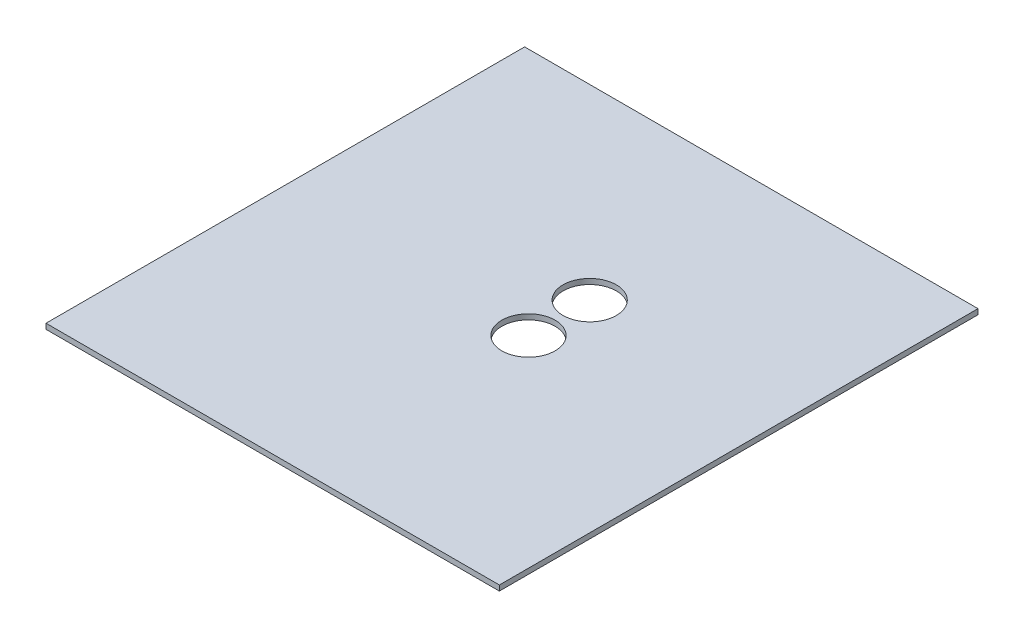
ISO-10303-21;
HEADER;
FILE_DESCRIPTION(('STEP AP214'),'2;1');
FILE_NAME('part.step','',(''),(''),'','','');
FILE_SCHEMA(('AUTOMOTIVE_DESIGN { 1 0 10303 214 1 1 1 1 }'));
ENDSEC;
DATA;
#1=APPLICATION_CONTEXT('core data for automotive mechanical design processes');
#2=APPLICATION_PROTOCOL_DEFINITION('international standard','automotive_design',2000,#1);
#3=PRODUCT_CONTEXT('',#1,'mechanical');
#4=PRODUCT('Part','Part','',(#3));
#5=PRODUCT_RELATED_PRODUCT_CATEGORY('part','',(#4));
#6=PRODUCT_DEFINITION_FORMATION('','',#4);
#7=PRODUCT_DEFINITION_CONTEXT('part definition',#1,'design');
#8=PRODUCT_DEFINITION('design','',#6,#7);
#9=PRODUCT_DEFINITION_SHAPE('','',#8);
#10=(LENGTH_UNIT() NAMED_UNIT(*) SI_UNIT(.MILLI.,.METRE.));
#11=(NAMED_UNIT(*) PLANE_ANGLE_UNIT() SI_UNIT($,.RADIAN.));
#12=(NAMED_UNIT(*) SI_UNIT($,.STERADIAN.) SOLID_ANGLE_UNIT());
#13=UNCERTAINTY_MEASURE_WITH_UNIT(LENGTH_MEASURE(1.E-05),#10,'distance_accuracy_value','');
#14=(GEOMETRIC_REPRESENTATION_CONTEXT(3) GLOBAL_UNCERTAINTY_ASSIGNED_CONTEXT((#13)) GLOBAL_UNIT_ASSIGNED_CONTEXT((#10,
#11,#12)) REPRESENTATION_CONTEXT('',''));
#15=CARTESIAN_POINT('',(0.,0.,0.));
#16=DIRECTION('',(0.,0.,1.));
#17=DIRECTION('',(1.,0.,0.));
#18=AXIS2_PLACEMENT_3D('',#15,#16,#17);
#19=CARTESIAN_POINT('',(-44.6262834338455,-2.,-26.2719249247639));
#20=DIRECTION('',(-1.,0.,0.));
#21=DIRECTION('',(0.,0.,1.));
#22=AXIS2_PLACEMENT_3D('',#19,#20,#21);
#23=PLANE('',#22);
#24=DIRECTION('',(0.,0.,1.));
#25=VECTOR('',#24,1.);
#26=CARTESIAN_POINT('',(-44.6262834338455,0.,-26.2719249247639));
#27=LINE('',#26,#25);
#28=CARTESIAN_POINT('',(-44.6262834338455,0.,-26.2719249247639));
#29=VERTEX_POINT('',#28);
#30=CARTESIAN_POINT('',(-44.6262834338455,0.,153.529323459775));
#31=VERTEX_POINT('',#30);
#32=EDGE_CURVE('E104',#29,#31,#27,.T.);
#33=ORIENTED_EDGE('',*,*,#32,.F.);
#34=DIRECTION('',(0.,1.,0.));
#35=VECTOR('',#34,1.);
#36=CARTESIAN_POINT('',(-44.6262834338455,-2.,-26.2719249247639));
#37=LINE('',#36,#35);
#38=CARTESIAN_POINT('',(-44.6262834338455,-2.,-26.2719249247639));
#39=VERTEX_POINT('',#38);
#40=EDGE_CURVE('E11',#39,#29,#37,.T.);
#41=ORIENTED_EDGE('',*,*,#40,.F.);
#42=DIRECTION('',(0.,0.,1.));
#43=VECTOR('',#42,1.);
#44=CARTESIAN_POINT('',(-44.6262834338455,-2.,-26.2719249247639));
#45=LINE('',#44,#43);
#46=CARTESIAN_POINT('',(-44.6262834338455,-2.,153.529323459775));
#47=VERTEX_POINT('',#46);
#48=EDGE_CURVE('E97',#39,#47,#45,.T.);
#49=ORIENTED_EDGE('',*,*,#48,.T.);
#50=DIRECTION('',(0.,1.,0.));
#51=VECTOR('',#50,1.);
#52=CARTESIAN_POINT('',(-44.6262834338455,-2.,153.529323459775));
#53=LINE('',#52,#51);
#54=EDGE_CURVE('E42',#47,#31,#53,.T.);
#55=ORIENTED_EDGE('',*,*,#54,.T.);
#56=EDGE_LOOP('',(#33,#41,#49,#55));
#57=FACE_BOUND('',#56,.T.);
#58=ADVANCED_FACE('F39',(#57),#23,.T.);
#59=CARTESIAN_POINT('',(-44.6262834338455,-2.,-26.2719249247639));
#60=DIRECTION('',(0.,0.,-1.));
#61=DIRECTION('',(-1.,0.,0.));
#62=AXIS2_PLACEMENT_3D('',#59,#60,#61);
#63=PLANE('',#62);
#64=DIRECTION('',(-1.,0.,0.));
#65=VECTOR('',#64,1.);
#66=CARTESIAN_POINT('',(-44.6262834338455,0.,-26.2719249247639));
#67=LINE('',#66,#65);
#68=CARTESIAN_POINT('',(125.68506485502,0.,-26.2719249247639));
#69=VERTEX_POINT('',#68);
#70=EDGE_CURVE('E99',#69,#29,#67,.T.);
#71=ORIENTED_EDGE('',*,*,#70,.F.);
#72=DIRECTION('',(0.,1.,0.));
#73=VECTOR('',#72,1.);
#74=CARTESIAN_POINT('',(125.68506485502,-2.,-26.2719249247639));
#75=LINE('',#74,#73);
#76=CARTESIAN_POINT('',(125.68506485502,-2.,-26.2719249247639));
#77=VERTEX_POINT('',#76);
#78=EDGE_CURVE('E48',#77,#69,#75,.T.);
#79=ORIENTED_EDGE('',*,*,#78,.F.);
#80=DIRECTION('',(-1.,0.,0.));
#81=VECTOR('',#80,1.);
#82=CARTESIAN_POINT('',(-44.6262834338455,-2.,-26.2719249247639));
#83=LINE('',#82,#81);
#84=EDGE_CURVE('E94',#77,#39,#83,.T.);
#85=ORIENTED_EDGE('',*,*,#84,.T.);
#86=ORIENTED_EDGE('',*,*,#40,.T.);
#87=EDGE_LOOP('',(#71,#79,#85,#86));
#88=FACE_BOUND('',#87,.T.);
#89=ADVANCED_FACE('F115',(#88),#63,.T.);
#90=CARTESIAN_POINT('',(125.68506485502,-2.,-26.2719249247639));
#91=DIRECTION('',(1.,0.,0.));
#92=DIRECTION('',(0.,0.,-1.));
#93=AXIS2_PLACEMENT_3D('',#90,#91,#92);
#94=PLANE('',#93);
#95=DIRECTION('',(0.,0.,-1.));
#96=VECTOR('',#95,1.);
#97=CARTESIAN_POINT('',(125.68506485502,0.,-26.2719249247639));
#98=LINE('',#97,#96);
#99=CARTESIAN_POINT('',(125.68506485502,0.,153.529323459775));
#100=VERTEX_POINT('',#99);
#101=EDGE_CURVE('E89',#100,#69,#98,.T.);
#102=ORIENTED_EDGE('',*,*,#101,.F.);
#103=DIRECTION('',(0.,1.,0.));
#104=VECTOR('',#103,1.);
#105=CARTESIAN_POINT('',(125.68506485502,-2.,153.529323459775));
#106=LINE('',#105,#104);
#107=CARTESIAN_POINT('',(125.68506485502,-2.,153.529323459775));
#108=VERTEX_POINT('',#107);
#109=EDGE_CURVE('E84',#108,#100,#106,.T.);
#110=ORIENTED_EDGE('',*,*,#109,.F.);
#111=DIRECTION('',(0.,0.,-1.));
#112=VECTOR('',#111,1.);
#113=CARTESIAN_POINT('',(125.68506485502,-2.,-26.2719249247639));
#114=LINE('',#113,#112);
#115=EDGE_CURVE('E87',#108,#77,#114,.T.);
#116=ORIENTED_EDGE('',*,*,#115,.T.);
#117=ORIENTED_EDGE('',*,*,#78,.T.);
#118=EDGE_LOOP('',(#102,#110,#116,#117));
#119=FACE_BOUND('',#118,.T.);
#120=ADVANCED_FACE('F86',(#119),#94,.T.);
#121=CARTESIAN_POINT('',(-44.6262834338455,-2.,153.529323459775));
#122=DIRECTION('',(0.,0.,1.));
#123=DIRECTION('',(1.,0.,0.));
#124=AXIS2_PLACEMENT_3D('',#121,#122,#123);
#125=PLANE('',#124);
#126=DIRECTION('',(1.,0.,0.));
#127=VECTOR('',#126,1.);
#128=CARTESIAN_POINT('',(-44.6262834338455,0.,153.529323459775));
#129=LINE('',#128,#127);
#130=EDGE_CURVE('E107',#31,#100,#129,.T.);
#131=ORIENTED_EDGE('',*,*,#130,.F.);
#132=ORIENTED_EDGE('',*,*,#54,.F.);
#133=DIRECTION('',(1.,0.,0.));
#134=VECTOR('',#133,1.);
#135=CARTESIAN_POINT('',(-44.6262834338455,-2.,153.529323459775));
#136=LINE('',#135,#134);
#137=EDGE_CURVE('E93',#47,#108,#136,.T.);
#138=ORIENTED_EDGE('',*,*,#137,.T.);
#139=ORIENTED_EDGE('',*,*,#109,.T.);
#140=EDGE_LOOP('',(#131,#132,#138,#139));
#141=FACE_BOUND('',#140,.T.);
#142=ADVANCED_FACE('F96',(#141),#125,.T.);
#143=CARTESIAN_POINT('',(0.,-2.,0.));
#144=DIRECTION('',(0.,1.,0.));
#145=DIRECTION('',(0.,0.,1.));
#146=AXIS2_PLACEMENT_3D('',#143,#144,#145);
#147=PLANE('',#146);
#148=CARTESIAN_POINT('',(49.9865499232897,-2.,43.8958022297375));
#149=DIRECTION('',(0.,1.,0.));
#150=DIRECTION('',(0.,0.,1.));
#151=AXIS2_PLACEMENT_3D('',#148,#149,#150);
#152=CIRCLE('',#151,10.);
#153=CARTESIAN_POINT('',(49.9865499232897,-2.,53.8958022297375));
#154=VERTEX_POINT('',#153);
#155=EDGE_CURVE('E108',#154,#154,#152,.T.);
#156=ORIENTED_EDGE('',*,*,#155,.T.);
#157=EDGE_LOOP('',(#156));
#158=FACE_BOUND('',#157,.T.);
#159=CARTESIAN_POINT('',(49.9865499232897,-2.,66.8958022297375));
#160=DIRECTION('',(0.,1.,0.));
#161=DIRECTION('',(0.,0.,1.));
#162=AXIS2_PLACEMENT_3D('',#159,#160,#161);
#163=CIRCLE('',#162,10.);
#164=CARTESIAN_POINT('',(49.9865499232897,-2.,76.8958022297375));
#165=VERTEX_POINT('',#164);
#166=EDGE_CURVE('E151',#165,#165,#163,.T.);
#167=ORIENTED_EDGE('',*,*,#166,.T.);
#168=EDGE_LOOP('',(#167));
#169=FACE_BOUND('',#168,.T.);
#170=ORIENTED_EDGE('',*,*,#48,.F.);
#171=ORIENTED_EDGE('',*,*,#84,.F.);
#172=ORIENTED_EDGE('',*,*,#115,.F.);
#173=ORIENTED_EDGE('',*,*,#137,.F.);
#174=EDGE_LOOP('',(#170,#171,#172,#173));
#175=FACE_BOUND('',#174,.T.);
#176=ADVANCED_FACE('F92',(#158,#169,#175),#147,.F.);
#177=CARTESIAN_POINT('',(0.,0.,0.));
#178=DIRECTION('',(0.,1.,0.));
#179=DIRECTION('',(0.,0.,1.));
#180=AXIS2_PLACEMENT_3D('',#177,#178,#179);
#181=PLANE('',#180);
#182=CARTESIAN_POINT('',(49.9865499232897,0.,43.8958022297375));
#183=DIRECTION('',(0.,1.,0.));
#184=DIRECTION('',(0.,0.,1.));
#185=AXIS2_PLACEMENT_3D('',#182,#183,#184);
#186=CIRCLE('',#185,10.);
#187=CARTESIAN_POINT('',(49.9865499232897,0.,53.8958022297375));
#188=VERTEX_POINT('',#187);
#189=EDGE_CURVE('E150',#188,#188,#186,.T.);
#190=ORIENTED_EDGE('',*,*,#189,.F.);
#191=EDGE_LOOP('',(#190));
#192=FACE_BOUND('',#191,.T.);
#193=CARTESIAN_POINT('',(49.9865499232897,0.,66.8958022297375));
#194=DIRECTION('',(0.,1.,0.));
#195=DIRECTION('',(0.,0.,1.));
#196=AXIS2_PLACEMENT_3D('',#193,#194,#195);
#197=CIRCLE('',#196,10.);
#198=CARTESIAN_POINT('',(49.9865499232897,0.,76.8958022297375));
#199=VERTEX_POINT('',#198);
#200=EDGE_CURVE('E155',#199,#199,#197,.T.);
#201=ORIENTED_EDGE('',*,*,#200,.F.);
#202=EDGE_LOOP('',(#201));
#203=FACE_BOUND('',#202,.T.);
#204=ORIENTED_EDGE('',*,*,#32,.T.);
#205=ORIENTED_EDGE('',*,*,#130,.T.);
#206=ORIENTED_EDGE('',*,*,#101,.T.);
#207=ORIENTED_EDGE('',*,*,#70,.T.);
#208=EDGE_LOOP('',(#204,#205,#206,#207));
#209=FACE_BOUND('',#208,.T.);
#210=ADVANCED_FACE('F114',(#192,#203,#209),#181,.T.);
#211=CARTESIAN_POINT('',(49.9865499232897,-2.,66.8958022297375));
#212=DIRECTION('',(0.,1.,0.));
#213=DIRECTION('',(0.,0.,1.));
#214=AXIS2_PLACEMENT_3D('',#211,#212,#213);
#215=CYLINDRICAL_SURFACE('',#214,10.);
#216=ORIENTED_EDGE('',*,*,#166,.F.);
#217=EDGE_LOOP('',(#216));
#218=FACE_BOUND('',#217,.T.);
#219=ORIENTED_EDGE('',*,*,#200,.T.);
#220=EDGE_LOOP('',(#219));
#221=FACE_BOUND('',#220,.T.);
#222=ADVANCED_FACE('F133',(#218,#221),#215,.F.);
#223=CARTESIAN_POINT('',(49.9865499232897,-2.,43.8958022297375));
#224=DIRECTION('',(0.,1.,0.));
#225=DIRECTION('',(0.,0.,1.));
#226=AXIS2_PLACEMENT_3D('',#223,#224,#225);
#227=CYLINDRICAL_SURFACE('',#226,10.);
#228=ORIENTED_EDGE('',*,*,#155,.F.);
#229=EDGE_LOOP('',(#228));
#230=FACE_BOUND('',#229,.T.);
#231=ORIENTED_EDGE('',*,*,#189,.T.);
#232=EDGE_LOOP('',(#231));
#233=FACE_BOUND('',#232,.T.);
#234=ADVANCED_FACE('F140',(#230,#233),#227,.F.);
#235=CLOSED_SHELL('',(#58,#89,#120,#142,#176,#210,#222,#234));
#236=MANIFOLD_SOLID_BREP('B2',#235);
#237=ADVANCED_BREP_SHAPE_REPRESENTATION('',(#18,#236),#14);
#238=SHAPE_DEFINITION_REPRESENTATION(#9,#237);
ENDSEC;
END-ISO-10303-21;
